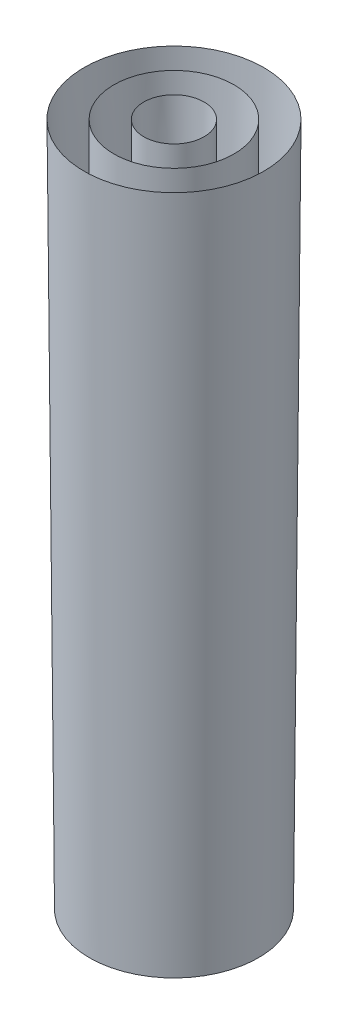
ISO-10303-21;
HEADER;
FILE_DESCRIPTION(('STEP AP214'),'2;1');
FILE_NAME('part.step','',(''),(''),'','','');
FILE_SCHEMA(('AUTOMOTIVE_DESIGN { 1 0 10303 214 1 1 1 1 }'));
ENDSEC;
DATA;
#1=APPLICATION_CONTEXT('core data for automotive mechanical design processes');
#2=APPLICATION_PROTOCOL_DEFINITION('international standard','automotive_design',2000,#1);
#3=PRODUCT_CONTEXT('',#1,'mechanical');
#4=PRODUCT('Part','Part','',(#3));
#5=PRODUCT_RELATED_PRODUCT_CATEGORY('part','',(#4));
#6=PRODUCT_DEFINITION_FORMATION('','',#4);
#7=PRODUCT_DEFINITION_CONTEXT('part definition',#1,'design');
#8=PRODUCT_DEFINITION('design','',#6,#7);
#9=PRODUCT_DEFINITION_SHAPE('','',#8);
#10=(LENGTH_UNIT() NAMED_UNIT(*) SI_UNIT(.MILLI.,.METRE.));
#11=(NAMED_UNIT(*) PLANE_ANGLE_UNIT() SI_UNIT($,.RADIAN.));
#12=(NAMED_UNIT(*) SI_UNIT($,.STERADIAN.) SOLID_ANGLE_UNIT());
#13=UNCERTAINTY_MEASURE_WITH_UNIT(LENGTH_MEASURE(1.E-05),#10,'distance_accuracy_value','');
#14=(GEOMETRIC_REPRESENTATION_CONTEXT(3) GLOBAL_UNCERTAINTY_ASSIGNED_CONTEXT((#13)) GLOBAL_UNIT_ASSIGNED_CONTEXT((#10,
#11,#12)) REPRESENTATION_CONTEXT('',''));
#15=CARTESIAN_POINT('',(0.,0.,0.));
#16=DIRECTION('',(0.,0.,1.));
#17=DIRECTION('',(1.,0.,0.));
#18=AXIS2_PLACEMENT_3D('',#15,#16,#17);
#19=CARTESIAN_POINT('',(-2.68774089119618,-0.113977440196589,0.));
#20=DIRECTION('',(0.,-1.,0.));
#21=DIRECTION('',(0.,0.,-1.));
#22=AXIS2_PLACEMENT_3D('',#19,#20,#21);
#23=CYLINDRICAL_SURFACE('',#22,13.1635379852024);
#24=CARTESIAN_POINT('',(-2.68774089119618,150.,0.));
#25=DIRECTION('',(0.,-1.,0.));
#26=DIRECTION('',(0.,0.,-1.));
#27=AXIS2_PLACEMENT_3D('',#24,#25,#26);
#28=CIRCLE('',#27,13.1635379852024);
#29=CARTESIAN_POINT('',(-2.68774089119618,150.,-13.1635379852024));
#30=VERTEX_POINT('',#29);
#31=EDGE_CURVE('E10',#30,#30,#28,.T.);
#32=ORIENTED_EDGE('',*,*,#31,.T.);
#33=EDGE_LOOP('',(#32));
#34=FACE_BOUND('',#33,.T.);
#35=CARTESIAN_POINT('',(-2.68774089119618,0.,0.));
#36=DIRECTION('',(0.,-1.,0.));
#37=DIRECTION('',(0.,0.,-1.));
#38=AXIS2_PLACEMENT_3D('',#35,#36,#37);
#39=CIRCLE('',#38,13.1635379852024);
#40=CARTESIAN_POINT('',(-2.68774089119618,0.,-13.1635379852024));
#41=VERTEX_POINT('',#40);
#42=EDGE_CURVE('E87',#41,#41,#39,.T.);
#43=ORIENTED_EDGE('',*,*,#42,.F.);
#44=EDGE_LOOP('',(#43));
#45=FACE_BOUND('',#44,.T.);
#46=ADVANCED_FACE('F32',(#34,#45),#23,.T.);
#47=CARTESIAN_POINT('',(-2.68774089119618,150.,0.));
#48=DIRECTION('',(0.,1.,0.));
#49=DIRECTION('',(0.,0.,1.));
#50=AXIS2_PLACEMENT_3D('',#47,#48,#49);
#51=CONICAL_SURFACE('',#50,13.1635379852024,0.0436386248836245);
#52=CARTESIAN_POINT('',(-2.68774089119618,0.,0.));
#53=DIRECTION('',(0.,-1.,0.));
#54=DIRECTION('',(0.,0.,-1.));
#55=AXIS2_PLACEMENT_3D('',#52,#53,#54);
#56=CIRCLE('',#55,6.61358596891927);
#57=CARTESIAN_POINT('',(-2.68774089119618,0.,-6.61358596891927));
#58=VERTEX_POINT('',#57);
#59=EDGE_CURVE('E38',#58,#58,#56,.T.);
#60=ORIENTED_EDGE('',*,*,#59,.T.);
#61=EDGE_LOOP('',(#60));
#62=FACE_BOUND('',#61,.T.);
#63=ORIENTED_EDGE('',*,*,#31,.F.);
#64=EDGE_LOOP('',(#63));
#65=FACE_BOUND('',#64,.T.);
#66=ADVANCED_FACE('F95',(#62,#65),#51,.F.);
#67=CARTESIAN_POINT('',(-2.68774089119618,-0.113977440196589,0.));
#68=DIRECTION('',(0.,-1.,0.));
#69=DIRECTION('',(0.,0.,-1.));
#70=AXIS2_PLACEMENT_3D('',#67,#68,#69);
#71=CYLINDRICAL_SURFACE('',#70,6.61358596891927);
#72=CARTESIAN_POINT('',(-2.68774089119618,150.,0.));
#73=DIRECTION('',(0.,-1.,0.));
#74=DIRECTION('',(0.,0.,-1.));
#75=AXIS2_PLACEMENT_3D('',#72,#73,#74);
#76=CIRCLE('',#75,6.61358596891927);
#77=CARTESIAN_POINT('',(-2.68774089119618,150.,6.61358596891927));
#78=VERTEX_POINT('',#77);
#79=EDGE_CURVE('E42',#78,#78,#76,.T.);
#80=ORIENTED_EDGE('',*,*,#79,.T.);
#81=EDGE_LOOP('',(#80));
#82=FACE_BOUND('',#81,.T.);
#83=ORIENTED_EDGE('',*,*,#59,.F.);
#84=EDGE_LOOP('',(#83));
#85=FACE_BOUND('',#84,.T.);
#86=ADVANCED_FACE('F99',(#82,#85),#71,.T.);
#87=CARTESIAN_POINT('',(-2.68774089119618,150.,0.));
#88=DIRECTION('',(0.,1.,0.));
#89=DIRECTION('',(0.,0.,1.));
#90=AXIS2_PLACEMENT_3D('',#87,#88,#89);
#91=CONICAL_SURFACE('',#90,6.61358596891927,0.0436386248836245);
#92=CARTESIAN_POINT('',(-2.68774089119618,0.,0.));
#93=DIRECTION('',(0.,-1.,0.));
#94=DIRECTION('',(0.,0.,-1.));
#95=AXIS2_PLACEMENT_3D('',#92,#93,#94);
#96=CIRCLE('',#95,0.0636339526361657);
#97=CARTESIAN_POINT('',(-2.68774089119618,0.,0.0636339526361674));
#98=VERTEX_POINT('',#97);
#99=EDGE_CURVE('E46',#98,#98,#96,.T.);
#100=CARTESIAN_POINT('',(-2.68774089119618,0.,0.0636339526361674));
#101=CARTESIAN_POINT('',(-2.68774089119618,1.56250000000003,0.13186261947245));
#102=CARTESIAN_POINT('',(-2.68774089119618,3.12500000000004,0.200091286308732));
#103=CARTESIAN_POINT('',(-2.68774089119618,6.25000000000003,0.336548619981297));
#104=CARTESIAN_POINT('',(-2.68774089119618,7.81250000000003,0.404777286817579));
#105=CARTESIAN_POINT('',(-2.68774089119618,10.9375,0.541234620490143));
#106=CARTESIAN_POINT('',(-2.68774089119618,12.5,0.609463287326426));
#107=CARTESIAN_POINT('',(-2.68774089119618,15.625,0.74592062099899));
#108=CARTESIAN_POINT('',(-2.68774089119618,17.1875,0.814149287835273));
#109=CARTESIAN_POINT('',(-2.68774089119618,20.3125,0.950606621507837));
#110=CARTESIAN_POINT('',(-2.68774089119618,21.875,1.01883528834412));
#111=CARTESIAN_POINT('',(-2.68774089119618,25.,1.15529262201668));
#112=CARTESIAN_POINT('',(-2.68774089119618,26.5625,1.22352128885297));
#113=CARTESIAN_POINT('',(-2.68774089119618,29.6875,1.35997862252553));
#114=CARTESIAN_POINT('',(-2.68774089119618,31.25,1.42820728936181));
#115=CARTESIAN_POINT('',(-2.68774089119618,34.375,1.56466462303438));
#116=CARTESIAN_POINT('',(-2.68774089119618,35.9375,1.63289328987066));
#117=CARTESIAN_POINT('',(-2.68774089119618,39.0625,1.76935062354322));
#118=CARTESIAN_POINT('',(-2.68774089119618,40.625,1.83757929037951));
#119=CARTESIAN_POINT('',(-2.68774089119618,43.75,1.97403662405207));
#120=CARTESIAN_POINT('',(-2.68774089119618,45.3125,2.04226529088835));
#121=CARTESIAN_POINT('',(-2.68774089119618,48.4375,2.17872262456092));
#122=CARTESIAN_POINT('',(-2.68774089119618,50.,2.2469512913972));
#123=CARTESIAN_POINT('',(-2.68774089119618,53.125,2.38340862506977));
#124=CARTESIAN_POINT('',(-2.68774089119618,54.6875,2.45163729190605));
#125=CARTESIAN_POINT('',(-2.68774089119618,57.8125,2.58809462557861));
#126=CARTESIAN_POINT('',(-2.68774089119618,59.375,2.65632329241489));
#127=CARTESIAN_POINT('',(-2.68774089119618,62.5,2.79278062608746));
#128=CARTESIAN_POINT('',(-2.68774089119618,64.0625,2.86100929292374));
#129=CARTESIAN_POINT('',(-2.68774089119618,67.1875,2.99746662659631));
#130=CARTESIAN_POINT('',(-2.68774089119618,68.75,3.06569529343259));
#131=CARTESIAN_POINT('',(-2.68774089119618,71.875,3.20215262710515));
#132=CARTESIAN_POINT('',(-2.68774089119618,73.4375,3.27038129394143));
#133=CARTESIAN_POINT('',(-2.68774089119618,76.5625,3.406838627614));
#134=CARTESIAN_POINT('',(-2.68774089119618,78.125,3.47506729445028));
#135=CARTESIAN_POINT('',(-2.68774089119618,81.25,3.61152462812285));
#136=CARTESIAN_POINT('',(-2.68774089119618,82.8125,3.67975329495913));
#137=CARTESIAN_POINT('',(-2.68774089119618,85.9375,3.81621062863169));
#138=CARTESIAN_POINT('',(-2.68774089119618,87.5,3.88443929546797));
#139=CARTESIAN_POINT('',(-2.68774089119618,90.625,4.02089662914054));
#140=CARTESIAN_POINT('',(-2.68774089119618,92.1875,4.08912529597682));
#141=CARTESIAN_POINT('',(-2.68774089119618,95.3125,4.22558262964939));
#142=CARTESIAN_POINT('',(-2.68774089119618,96.875,4.29381129648567));
#143=CARTESIAN_POINT('',(-2.68774089119618,100.,4.43026863015823));
#144=CARTESIAN_POINT('',(-2.68774089119618,101.5625,4.49849729699452));
#145=CARTESIAN_POINT('',(-2.68774089119618,104.6875,4.63495463066708));
#146=CARTESIAN_POINT('',(-2.68774089119618,106.25,4.70318329750336));
#147=CARTESIAN_POINT('',(-2.68774089119618,109.375,4.83964063117593));
#148=CARTESIAN_POINT('',(-2.68774089119618,110.9375,4.90786929801221));
#149=CARTESIAN_POINT('',(-2.68774089119618,114.0625,5.04432663168477));
#150=CARTESIAN_POINT('',(-2.68774089119618,115.625,5.11255529852106));
#151=CARTESIAN_POINT('',(-2.68774089119618,118.75,5.24901263219362));
#152=CARTESIAN_POINT('',(-2.68774089119618,120.3125,5.3172412990299));
#153=CARTESIAN_POINT('',(-2.68774089119618,123.4375,5.45369863270247));
#154=CARTESIAN_POINT('',(-2.68774089119618,125.,5.52192729953875));
#155=CARTESIAN_POINT('',(-2.68774089119618,128.125,5.65838463321131));
#156=CARTESIAN_POINT('',(-2.68774089119618,129.6875,5.7266133000476));
#157=CARTESIAN_POINT('',(-2.68774089119618,132.8125,5.86307063372016));
#158=CARTESIAN_POINT('',(-2.68774089119618,134.375,5.93129930055644));
#159=CARTESIAN_POINT('',(-2.68774089119618,137.5,6.06775663422901));
#160=CARTESIAN_POINT('',(-2.68774089119618,139.0625,6.13598530106529));
#161=CARTESIAN_POINT('',(-2.68774089119618,142.1875,6.27244263473786));
#162=CARTESIAN_POINT('',(-2.68774089119618,143.75,6.34067130157414));
#163=CARTESIAN_POINT('',(-2.68774089119618,146.875,6.4771286352467));
#164=CARTESIAN_POINT('',(-2.68774089119618,148.4375,6.54535730208298));
#165=CARTESIAN_POINT('',(-2.68774089119618,150.,6.61358596891927));
#166=B_SPLINE_CURVE_WITH_KNOTS('',3,(#100,#101,#102,#103,#104,#105,#106,#107,#108,#109,#110,
#111,#112,#113,#114,#115,#116,#117,#118,#119,#120,#121,#122,#123,#124,#125,#126,#127,#128,#129,
#130,#131,#132,#133,#134,#135,#136,#137,#138,#139,#140,#141,#142,#143,#144,#145,#146,#147,#148,
#149,#150,#151,#152,#153,#154,#155,#156,#157,#158,#159,#160,#161,#162,#163,#164,#165),
.UNSPECIFIED.,.F.,.F.,(4,2,2,2,2,2,2,2,2,2,2,2,2,2,2,2,2,2,2,2,2,2,2,2,2,2,2,2,2,2,2,2,4),(0.,
4.69196681667767,9.38393363335532,14.075900450033,18.7678672667106,23.4598340833883,
28.151800900066,32.8437677167436,37.5357345334213,42.2277013500989,46.9196681667766,
51.6116349834543,56.3036018001319,60.9955686168096,65.6875354334873,70.3795022501649,
75.0714690668426,79.7634358835202,84.4554027001979,89.1473695168756,93.8393363335532,
98.5313031502309,103.223269966909,107.915236783586,112.607203600264,117.299170416942,
121.991137233619,126.683104050297,131.375070866975,136.067037683652,140.75900450033,
145.450971317007,150.142938133685),.UNSPECIFIED.);
#167=EDGE_CURVE('BSEAM103',#98,#78,#166,.T.);
#168=ORIENTED_EDGE('',*,*,#99,.T.);
#169=ORIENTED_EDGE('',*,*,#79,.F.);
#170=ORIENTED_EDGE('',*,*,#167,.T.);
#171=ORIENTED_EDGE('',*,*,#167,.F.);
#172=EDGE_LOOP('',(#168,#170,#169,#171));
#173=FACE_BOUND('',#172,.T.);
#174=ADVANCED_FACE('F103',(#173),#91,.F.);
#175=CARTESIAN_POINT('',(-2.62410693856001,0.,0.));
#176=DIRECTION('',(0.,-1.,0.));
#177=DIRECTION('',(0.,0.,-1.));
#178=AXIS2_PLACEMENT_3D('',#175,#176,#177);
#179=PLANE('',#178);
#180=CARTESIAN_POINT('',(-2.68774089119618,0.,0.));
#181=DIRECTION('',(0.,-1.,0.));
#182=DIRECTION('',(0.,0.,-1.));
#183=AXIS2_PLACEMENT_3D('',#180,#181,#182);
#184=CIRCLE('',#183,0.752054863031253);
#185=CARTESIAN_POINT('',(-2.68774089119618,0.,0.752054863031253));
#186=VERTEX_POINT('',#185);
#187=EDGE_CURVE('E51',#186,#186,#184,.T.);
#188=ORIENTED_EDGE('',*,*,#187,.T.);
#189=EDGE_LOOP('',(#188));
#190=FACE_BOUND('',#189,.T.);
#191=ORIENTED_EDGE('',*,*,#99,.F.);
#192=EDGE_LOOP('',(#191));
#193=FACE_BOUND('',#192,.T.);
#194=ADVANCED_FACE('F110',(#190,#193),#179,.T.);
#195=CARTESIAN_POINT('',(-2.68774089119618,0.,0.));
#196=DIRECTION('',(0.,1.,0.));
#197=DIRECTION('',(0.,0.,1.));
#198=AXIS2_PLACEMENT_3D('',#195,#196,#197);
#199=CONICAL_SURFACE('',#198,0.752054863031253,0.0468597845553266);
#200=CARTESIAN_POINT('',(-2.68774089119618,109.948786309102,0.));
#201=DIRECTION('',(0.,-1.,0.));
#202=DIRECTION('',(0.,0.,-1.));
#203=AXIS2_PLACEMENT_3D('',#200,#201,#202);
#204=CIRCLE('',#203,5.9080057342038);
#205=CARTESIAN_POINT('',(-2.68774089119618,109.948786309102,5.9080057342038));
#206=VERTEX_POINT('',#205);
#207=EDGE_CURVE('E54',#206,#206,#204,.T.);
#208=CARTESIAN_POINT('',(-2.68774089119618,109.948786309102,5.9080057342038));
#209=CARTESIAN_POINT('',(-2.68774089119618,108.803486451716,5.85429791262909));
#210=CARTESIAN_POINT('',(-2.68774089119618,107.658186594329,5.80059009105437));
#211=CARTESIAN_POINT('',(-2.68774089119618,105.367586879556,5.69317444790494));
#212=CARTESIAN_POINT('',(-2.68774089119618,104.22228702217,5.63946662633023));
#213=CARTESIAN_POINT('',(-2.68774089119618,101.931687307397,5.5320509831808));
#214=CARTESIAN_POINT('',(-2.68774089119618,100.78638745001,5.47834316160609));
#215=CARTESIAN_POINT('',(-2.68774089119618,98.4957877352372,5.37092751845666));
#216=CARTESIAN_POINT('',(-2.68774089119618,97.3504878778508,5.31721969688194));
#217=CARTESIAN_POINT('',(-2.68774089119618,95.0598881630778,5.20980405373252));
#218=CARTESIAN_POINT('',(-2.68774089119618,93.9145883056913,5.1560962321578));
#219=CARTESIAN_POINT('',(-2.68774089119618,91.6239885909184,5.04868058900838));
#220=CARTESIAN_POINT('',(-2.68774089119618,90.4786887335319,4.99497276743366));
#221=CARTESIAN_POINT('',(-2.68774089119618,88.1880890187589,4.88755712428423));
#222=CARTESIAN_POINT('',(-2.68774089119618,87.0427891613725,4.83384930270952));
#223=CARTESIAN_POINT('',(-2.68774089119618,84.7521894465995,4.72643365956009));
#224=CARTESIAN_POINT('',(-2.68774089119618,83.606889589213,4.67272583798538));
#225=CARTESIAN_POINT('',(-2.68774089119618,81.31628987444,4.56531019483595));
#226=CARTESIAN_POINT('',(-2.68774089119618,80.1709900170536,4.51160237326124));
#227=CARTESIAN_POINT('',(-2.68774089119618,77.8803903022806,4.40418673011181));
#228=CARTESIAN_POINT('',(-2.68774089119618,76.7350904448941,4.35047890853709));
#229=CARTESIAN_POINT('',(-2.68774089119618,74.4444907301212,4.24306326538767));
#230=CARTESIAN_POINT('',(-2.68774089119618,73.2991908727347,4.18935544381295));
#231=CARTESIAN_POINT('',(-2.68774089119618,71.0085911579617,4.08193980066352));
#232=CARTESIAN_POINT('',(-2.68774089119618,69.8632913005753,4.02823197908881));
#233=CARTESIAN_POINT('',(-2.68774089119618,67.5726915858023,3.92081633593938));
#234=CARTESIAN_POINT('',(-2.68774089119618,66.4273917284158,3.86710851436467));
#235=CARTESIAN_POINT('',(-2.68774089119618,64.1367920136429,3.75969287121524));
#236=CARTESIAN_POINT('',(-2.68774089119618,62.9914921562564,3.70598504964052));
#237=CARTESIAN_POINT('',(-2.68774089119618,60.7008924414834,3.5985694064911));
#238=CARTESIAN_POINT('',(-2.68774089119618,59.5555925840969,3.54486158491638));
#239=CARTESIAN_POINT('',(-2.68774089119618,57.264992869324,3.43744594176695));
#240=CARTESIAN_POINT('',(-2.68774089119618,56.1196930119375,3.38373812019224));
#241=CARTESIAN_POINT('',(-2.68774089119618,53.8290932971645,3.27632247704281));
#242=CARTESIAN_POINT('',(-2.68774089119618,52.6837934397781,3.2226146554681));
#243=CARTESIAN_POINT('',(-2.68774089119618,50.3931937250051,3.11519901231867));
#244=CARTESIAN_POINT('',(-2.68774089119618,49.2478938676186,3.06149119074396));
#245=CARTESIAN_POINT('',(-2.68774089119618,46.9572941528457,2.95407554759453));
#246=CARTESIAN_POINT('',(-2.68774089119618,45.8119942954592,2.90036772601981));
#247=CARTESIAN_POINT('',(-2.68774089119618,43.5213945806862,2.79295208287039));
#248=CARTESIAN_POINT('',(-2.68774089119618,42.3760947232998,2.73924426129567));
#249=CARTESIAN_POINT('',(-2.68774089119618,40.0854950085268,2.63182861814624));
#250=CARTESIAN_POINT('',(-2.68774089119618,38.9401951511403,2.57812079657153));
#251=CARTESIAN_POINT('',(-2.68774089119618,36.6495954363673,2.4707051534221));
#252=CARTESIAN_POINT('',(-2.68774089119618,35.5042955789809,2.41699733184739));
#253=CARTESIAN_POINT('',(-2.68774089119618,33.2136958642079,2.30958168869796));
#254=CARTESIAN_POINT('',(-2.68774089119618,32.0683960068214,2.25587386712325));
#255=CARTESIAN_POINT('',(-2.68774089119618,29.7777962920485,2.14845822397382));
#256=CARTESIAN_POINT('',(-2.68774089119618,28.632496434662,2.0947504023991));
#257=CARTESIAN_POINT('',(-2.68774089119618,26.341896719889,1.98733475924968));
#258=CARTESIAN_POINT('',(-2.68774089119618,25.1965968625026,1.93362693767496));
#259=CARTESIAN_POINT('',(-2.68774089119618,22.9059971477296,1.82621129452553));
#260=CARTESIAN_POINT('',(-2.68774089119618,21.7606972903431,1.77250347295082));
#261=CARTESIAN_POINT('',(-2.68774089119618,19.4700975755702,1.66508782980139));
#262=CARTESIAN_POINT('',(-2.68774089119618,18.3247977181837,1.61138000822668));
#263=CARTESIAN_POINT('',(-2.68774089119618,16.0341980034107,1.50396436507725));
#264=CARTESIAN_POINT('',(-2.68774089119618,14.8888981460242,1.45025654350253));
#265=CARTESIAN_POINT('',(-2.68774089119618,12.5982984312513,1.34284090035311));
#266=CARTESIAN_POINT('',(-2.68774089119618,11.4529985738648,1.28913307877839));
#267=CARTESIAN_POINT('',(-2.68774089119618,9.16239885909183,1.18171743562896));
#268=CARTESIAN_POINT('',(-2.68774089119618,8.01709900170535,1.12800961405425));
#269=CARTESIAN_POINT('',(-2.68774089119618,5.72649928693239,1.02059397090482));
#270=CARTESIAN_POINT('',(-2.68774089119618,4.58119942954592,0.966886149330109));
#271=CARTESIAN_POINT('',(-2.68774089119618,2.29059971477296,0.859470506180681));
#272=CARTESIAN_POINT('',(-2.68774089119618,1.14529985738648,0.805762684605967));
#273=CARTESIAN_POINT('',(-2.68774089119618,0.,0.752054863031253));
#274=B_SPLINE_CURVE_WITH_KNOTS('',3,(#208,#209,#210,#211,#212,#213,#214,#215,#216,#217,#218,
#219,#220,#221,#222,#223,#224,#225,#226,#227,#228,#229,#230,#231,#232,#233,#234,#235,#236,#237,
#238,#239,#240,#241,#242,#243,#244,#245,#246,#247,#248,#249,#250,#251,#252,#253,#254,#255,#256,
#257,#258,#259,#260,#261,#262,#263,#264,#265,#266,#267,#268,#269,#270,#271,#272,#273),
.UNSPECIFIED.,.F.,.F.,(4,2,2,2,2,2,2,2,2,2,2,2,2,2,2,2,2,2,2,2,2,2,2,2,2,2,2,2,2,2,2,2,4),(0.,
3.43967536852682,6.87935073705364,10.3190261055805,13.7587014741073,17.1983768426341,
20.6380522111609,24.0777275796878,27.5174029482146,30.9570783167414,34.3967536852682,
37.836429053795,41.2761044223219,44.7157797908487,48.1554551593755,51.5951305279023,
55.0348058964292,58.474481264956,61.9141566334828,65.3538320020096,68.7935073705364,
72.2331827390633,75.6728581075901,79.1125334761169,82.5522088446438,85.9918842131706,
89.4315595816974,92.8712349502242,96.3109103187511,99.7505856872779,103.190261055805,
106.629936424332,110.069611792858),.UNSPECIFIED.);
#275=EDGE_CURVE('BSEAM114',#206,#186,#274,.T.);
#276=ORIENTED_EDGE('',*,*,#207,.T.);
#277=ORIENTED_EDGE('',*,*,#187,.F.);
#278=ORIENTED_EDGE('',*,*,#275,.T.);
#279=ORIENTED_EDGE('',*,*,#275,.F.);
#280=EDGE_LOOP('',(#276,#278,#277,#279));
#281=FACE_BOUND('',#280,.T.);
#282=ADVANCED_FACE('F114',(#281),#199,.T.);
#283=CARTESIAN_POINT('',(-2.68774089119618,109.948786309102,0.));
#284=DIRECTION('',(0.,-1.,0.));
#285=DIRECTION('',(0.,0.,-1.));
#286=AXIS2_PLACEMENT_3D('',#283,#284,#285);
#287=CONICAL_SURFACE('',#286,5.9080057342038,0.00276014159136249);
#288=CARTESIAN_POINT('',(-2.68774089119618,-1.13306457345138,0.));
#289=DIRECTION('',(0.,-1.,0.));
#290=DIRECTION('',(0.,0.,-1.));
#291=AXIS2_PLACEMENT_3D('',#288,#289,#290);
#292=CIRCLE('',#291,6.21460814947539);
#293=CARTESIAN_POINT('',(-2.68774089119618,-1.13306457345138,-6.21460814947539));
#294=VERTEX_POINT('',#293);
#295=EDGE_CURVE('E57',#294,#294,#292,.T.);
#296=ORIENTED_EDGE('',*,*,#295,.T.);
#297=EDGE_LOOP('',(#296));
#298=FACE_BOUND('',#297,.T.);
#299=ORIENTED_EDGE('',*,*,#207,.F.);
#300=EDGE_LOOP('',(#299));
#301=FACE_BOUND('',#300,.T.);
#302=ADVANCED_FACE('F118',(#298,#301),#287,.F.);
#303=CARTESIAN_POINT('',(3.52686725827921,-1.13306457345138,0.));
#304=DIRECTION('',(0.,-1.,0.));
#305=DIRECTION('',(0.,0.,-1.));
#306=AXIS2_PLACEMENT_3D('',#303,#304,#305);
#307=PLANE('',#306);
#308=CARTESIAN_POINT('',(-2.68774089119618,-1.13306457345138,0.));
#309=DIRECTION('',(0.,-1.,0.));
#310=DIRECTION('',(0.,0.,-1.));
#311=AXIS2_PLACEMENT_3D('',#308,#309,#310);
#312=CIRCLE('',#311,6.94644573233115);
#313=CARTESIAN_POINT('',(-2.68774089119618,-1.13306457345138,-6.94644573233115));
#314=VERTEX_POINT('',#313);
#315=EDGE_CURVE('E60',#314,#314,#312,.T.);
#316=ORIENTED_EDGE('',*,*,#315,.T.);
#317=EDGE_LOOP('',(#316));
#318=FACE_BOUND('',#317,.T.);
#319=ORIENTED_EDGE('',*,*,#295,.F.);
#320=EDGE_LOOP('',(#319));
#321=FACE_BOUND('',#320,.T.);
#322=ADVANCED_FACE('F122',(#318,#321),#307,.T.);
#323=CARTESIAN_POINT('',(-2.68774089119618,6.14796577547872,0.));
#324=DIRECTION('',(0.,1.,0.));
#325=DIRECTION('',(0.,0.,1.));
#326=AXIS2_PLACEMENT_3D('',#323,#324,#325);
#327=CONICAL_SURFACE('',#326,7.28788319636154,0.0468597845553265);
#328=CARTESIAN_POINT('',(-2.68774089119618,109.948786309102,0.));
#329=DIRECTION('',(0.,-1.,0.));
#330=DIRECTION('',(0.,0.,-1.));
#331=AXIS2_PLACEMENT_3D('',#328,#329,#330);
#332=CIRCLE('',#331,12.1555306622841);
#333=CARTESIAN_POINT('',(-2.68774089119618,109.948786309102,-12.1555306622841));
#334=VERTEX_POINT('',#333);
#335=EDGE_CURVE('E63',#334,#334,#332,.T.);
#336=ORIENTED_EDGE('',*,*,#335,.T.);
#337=EDGE_LOOP('',(#336));
#338=FACE_BOUND('',#337,.T.);
#339=ORIENTED_EDGE('',*,*,#315,.F.);
#340=EDGE_LOOP('',(#339));
#341=FACE_BOUND('',#340,.T.);
#342=ADVANCED_FACE('F126',(#338,#341),#327,.T.);
#343=CARTESIAN_POINT('',(-2.68774089119618,109.948786309102,0.));
#344=DIRECTION('',(0.,-1.,0.));
#345=DIRECTION('',(0.,0.,-1.));
#346=AXIS2_PLACEMENT_3D('',#343,#344,#345);
#347=CONICAL_SURFACE('',#346,12.1555306622841,0.00651541421237794);
#348=CARTESIAN_POINT('',(-2.68774089119618,-0.846269258078625,0.));
#349=DIRECTION('',(0.,-1.,0.));
#350=DIRECTION('',(0.,0.,-1.));
#351=AXIS2_PLACEMENT_3D('',#348,#349,#350);
#352=CIRCLE('',#351,12.8774165568518);
#353=CARTESIAN_POINT('',(-2.68774089119618,-0.846269258078625,-12.8774165568518));
#354=VERTEX_POINT('',#353);
#355=EDGE_CURVE('E66',#354,#354,#352,.T.);
#356=ORIENTED_EDGE('',*,*,#355,.T.);
#357=EDGE_LOOP('',(#356));
#358=FACE_BOUND('',#357,.T.);
#359=ORIENTED_EDGE('',*,*,#335,.F.);
#360=EDGE_LOOP('',(#359));
#361=FACE_BOUND('',#360,.T.);
#362=ADVANCED_FACE('F130',(#358,#361),#347,.F.);
#363=CARTESIAN_POINT('',(10.1896756656556,-0.846269258078625,0.));
#364=DIRECTION('',(0.,-1.,0.));
#365=DIRECTION('',(0.,0.,-1.));
#366=AXIS2_PLACEMENT_3D('',#363,#364,#365);
#367=PLANE('',#366);
#368=CARTESIAN_POINT('',(-2.68774089119618,-0.846269258078625,0.));
#369=DIRECTION('',(0.,-1.,0.));
#370=DIRECTION('',(0.,0.,-1.));
#371=AXIS2_PLACEMENT_3D('',#368,#369,#370);
#372=CIRCLE('',#371,13.6775426388821);
#373=CARTESIAN_POINT('',(-2.68774089119618,-0.846269258078625,-13.6775426388821));
#374=VERTEX_POINT('',#373);
#375=EDGE_CURVE('E69',#374,#374,#372,.T.);
#376=ORIENTED_EDGE('',*,*,#375,.T.);
#377=EDGE_LOOP('',(#376));
#378=FACE_BOUND('',#377,.T.);
#379=ORIENTED_EDGE('',*,*,#355,.F.);
#380=EDGE_LOOP('',(#379));
#381=FACE_BOUND('',#380,.T.);
#382=ADVANCED_FACE('F134',(#378,#381),#367,.T.);
#383=CARTESIAN_POINT('',(-2.68774089119618,-0.846269258078625,0.));
#384=DIRECTION('',(0.,1.,0.));
#385=DIRECTION('',(0.,0.,1.));
#386=AXIS2_PLACEMENT_3D('',#383,#384,#385);
#387=CONICAL_SURFACE('',#386,13.6775426388821,0.0468597845553265);
#388=CARTESIAN_POINT('',(-2.68774089119618,13.9633764616789,0.));
#389=DIRECTION('',(0.,-1.,0.));
#390=DIRECTION('',(0.,0.,-1.));
#391=AXIS2_PLACEMENT_3D('',#388,#389,#390);
#392=CIRCLE('',#391,14.372027847076);
#393=CARTESIAN_POINT('',(-2.68774089119618,13.9633764616789,-14.372027847076));
#394=VERTEX_POINT('',#393);
#395=EDGE_CURVE('E72',#394,#394,#392,.T.);
#396=ORIENTED_EDGE('',*,*,#395,.T.);
#397=EDGE_LOOP('',(#396));
#398=FACE_BOUND('',#397,.T.);
#399=ORIENTED_EDGE('',*,*,#375,.F.);
#400=EDGE_LOOP('',(#399));
#401=FACE_BOUND('',#400,.T.);
#402=ADVANCED_FACE('F138',(#398,#401),#387,.T.);
#403=CARTESIAN_POINT('',(-2.68774089119618,13.9633764616789,0.));
#404=DIRECTION('',(0.,1.,0.));
#405=DIRECTION('',(0.,0.,1.));
#406=AXIS2_PLACEMENT_3D('',#403,#404,#405);
#407=CONICAL_SURFACE('',#406,14.372027847076,0.0431613688581194);
#408=CARTESIAN_POINT('',(-2.68774089119618,110.472540020142,0.));
#409=DIRECTION('',(0.,-1.,0.));
#410=DIRECTION('',(0.,0.,-1.));
#411=AXIS2_PLACEMENT_3D('',#408,#409,#410);
#412=CIRCLE('',#411,18.5400840042746);
#413=CARTESIAN_POINT('',(-2.68774089119618,110.472540020142,-18.5400840042746));
#414=VERTEX_POINT('',#413);
#415=EDGE_CURVE('E75',#414,#414,#412,.T.);
#416=ORIENTED_EDGE('',*,*,#415,.T.);
#417=EDGE_LOOP('',(#416));
#418=FACE_BOUND('',#417,.T.);
#419=ORIENTED_EDGE('',*,*,#395,.F.);
#420=EDGE_LOOP('',(#419));
#421=FACE_BOUND('',#420,.T.);
#422=ADVANCED_FACE('F142',(#418,#421),#407,.T.);
#423=CARTESIAN_POINT('',(-2.68774089119618,110.472540020142,0.));
#424=DIRECTION('',(0.,1.,0.));
#425=DIRECTION('',(0.,0.,1.));
#426=AXIS2_PLACEMENT_3D('',#423,#424,#425);
#427=CONICAL_SURFACE('',#426,18.5400840042746,0.00489262385595541);
#428=CARTESIAN_POINT('',(-2.68774089119618,0.,0.));
#429=DIRECTION('',(0.,-1.,0.));
#430=DIRECTION('',(0.,0.,-1.));
#431=AXIS2_PLACEMENT_3D('',#428,#429,#430);
#432=CIRCLE('',#431,17.9995791067102);
#433=CARTESIAN_POINT('',(-2.68774089119618,0.,-17.9995791067102));
#434=VERTEX_POINT('',#433);
#435=EDGE_CURVE('E78',#434,#434,#432,.T.);
#436=ORIENTED_EDGE('',*,*,#435,.T.);
#437=EDGE_LOOP('',(#436));
#438=FACE_BOUND('',#437,.T.);
#439=ORIENTED_EDGE('',*,*,#415,.F.);
#440=EDGE_LOOP('',(#439));
#441=FACE_BOUND('',#440,.T.);
#442=ADVANCED_FACE('F146',(#438,#441),#427,.F.);
#443=CARTESIAN_POINT('',(15.311838215514,0.,0.));
#444=DIRECTION('',(0.,-1.,0.));
#445=DIRECTION('',(0.,0.,-1.));
#446=AXIS2_PLACEMENT_3D('',#443,#444,#445);
#447=PLANE('',#446);
#448=CARTESIAN_POINT('',(-2.68774089119618,0.,0.));
#449=DIRECTION('',(0.,-1.,0.));
#450=DIRECTION('',(0.,0.,-1.));
#451=AXIS2_PLACEMENT_3D('',#448,#449,#450);
#452=CIRCLE('',#451,18.5475728977633);
#453=CARTESIAN_POINT('',(-2.68774089119618,0.,-18.5475728977633));
#454=VERTEX_POINT('',#453);
#455=EDGE_CURVE('E81',#454,#454,#452,.T.);
#456=ORIENTED_EDGE('',*,*,#455,.T.);
#457=EDGE_LOOP('',(#456));
#458=FACE_BOUND('',#457,.T.);
#459=ORIENTED_EDGE('',*,*,#435,.F.);
#460=EDGE_LOOP('',(#459));
#461=FACE_BOUND('',#460,.T.);
#462=ADVANCED_FACE('F150',(#458,#461),#447,.T.);
#463=CARTESIAN_POINT('',(-2.68774089119618,0.,0.));
#464=DIRECTION('',(0.,1.,0.));
#465=DIRECTION('',(0.,0.,1.));
#466=AXIS2_PLACEMENT_3D('',#463,#464,#465);
#467=CONICAL_SURFACE('',#466,18.5475728977633,0.0077726241634057);
#468=CARTESIAN_POINT('',(-2.68774089119618,150.,0.));
#469=DIRECTION('',(0.,-1.,0.));
#470=DIRECTION('',(0.,0.,-1.));
#471=AXIS2_PLACEMENT_3D('',#468,#469,#470);
#472=CIRCLE('',#471,19.7134900014855);
#473=CARTESIAN_POINT('',(-2.68774089119618,150.,-19.7134900014855));
#474=VERTEX_POINT('',#473);
#475=EDGE_CURVE('E84',#474,#474,#472,.T.);
#476=ORIENTED_EDGE('',*,*,#475,.T.);
#477=EDGE_LOOP('',(#476));
#478=FACE_BOUND('',#477,.T.);
#479=ORIENTED_EDGE('',*,*,#455,.F.);
#480=EDGE_LOOP('',(#479));
#481=FACE_BOUND('',#480,.T.);
#482=ADVANCED_FACE('F154',(#478,#481),#467,.T.);
#483=CARTESIAN_POINT('',(-2.68774089119618,150.,0.));
#484=DIRECTION('',(0.,1.,0.));
#485=DIRECTION('',(0.,0.,1.));
#486=AXIS2_PLACEMENT_3D('',#483,#484,#485);
#487=CONICAL_SURFACE('',#486,19.7134900014855,0.0436386248836245);
#488=ORIENTED_EDGE('',*,*,#42,.T.);
#489=EDGE_LOOP('',(#488));
#490=FACE_BOUND('',#489,.T.);
#491=ORIENTED_EDGE('',*,*,#475,.F.);
#492=EDGE_LOOP('',(#491));
#493=FACE_BOUND('',#492,.T.);
#494=ADVANCED_FACE('F91',(#490,#493),#487,.F.);
#495=CLOSED_SHELL('',(#46,#66,#86,#174,#194,#282,#302,#322,#342,#362,#382,#402,#422,#442,#462,
#482,#494));
#496=MANIFOLD_SOLID_BREP('B2',#495);
#497=ADVANCED_BREP_SHAPE_REPRESENTATION('',(#18,#496),#14);
#498=SHAPE_DEFINITION_REPRESENTATION(#9,#497);
ENDSEC;
END-ISO-10303-21;
